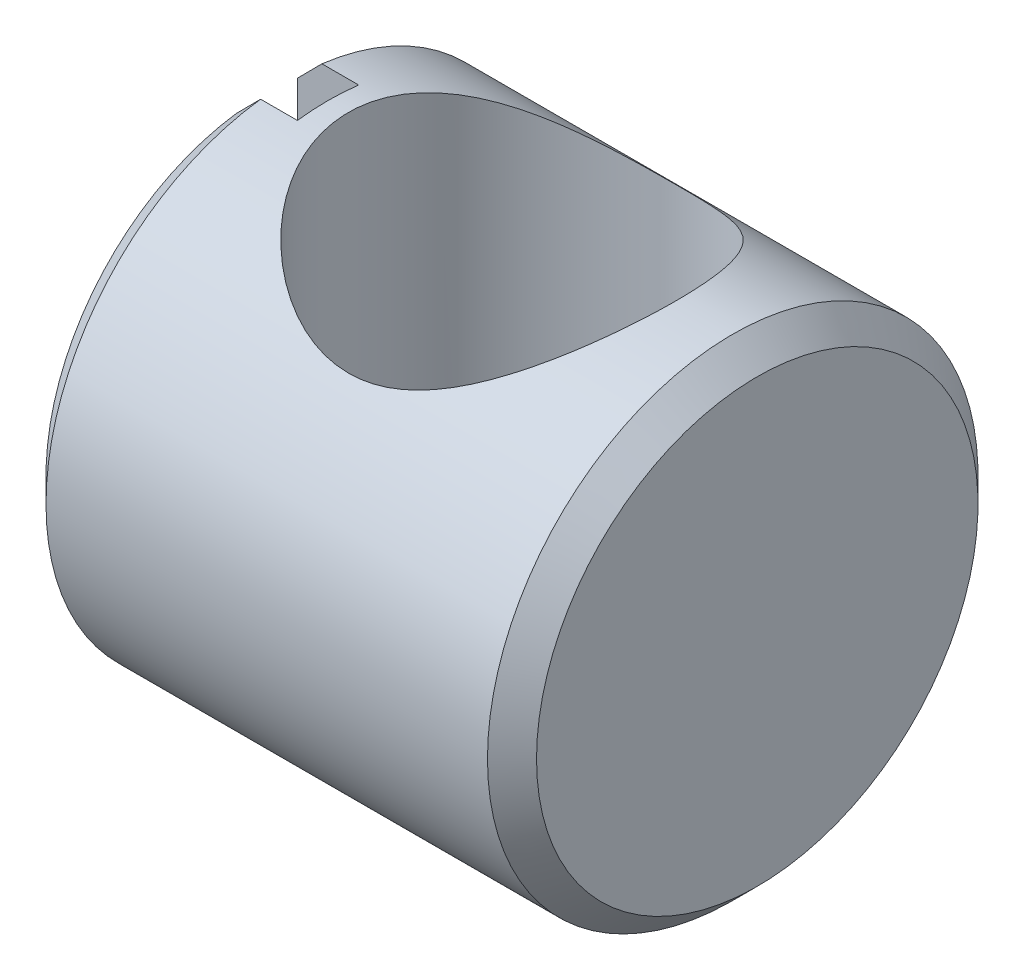
ISO-10303-21;
HEADER;
FILE_DESCRIPTION(('STEP AP214'),'2;1');
FILE_NAME('part.step','',(''),(''),'','','');
FILE_SCHEMA(('AUTOMOTIVE_DESIGN { 1 0 10303 214 1 1 1 1 }'));
ENDSEC;
DATA;
#1=APPLICATION_CONTEXT('core data for automotive mechanical design processes');
#2=APPLICATION_PROTOCOL_DEFINITION('international standard','automotive_design',2000,#1);
#3=PRODUCT_CONTEXT('',#1,'mechanical');
#4=PRODUCT('Part','Part','',(#3));
#5=PRODUCT_RELATED_PRODUCT_CATEGORY('part','',(#4));
#6=PRODUCT_DEFINITION_FORMATION('','',#4);
#7=PRODUCT_DEFINITION_CONTEXT('part definition',#1,'design');
#8=PRODUCT_DEFINITION('design','',#6,#7);
#9=PRODUCT_DEFINITION_SHAPE('','',#8);
#10=(LENGTH_UNIT() NAMED_UNIT(*) SI_UNIT(.MILLI.,.METRE.));
#11=(NAMED_UNIT(*) PLANE_ANGLE_UNIT() SI_UNIT($,.RADIAN.));
#12=(NAMED_UNIT(*) SI_UNIT($,.STERADIAN.) SOLID_ANGLE_UNIT());
#13=UNCERTAINTY_MEASURE_WITH_UNIT(LENGTH_MEASURE(1.E-05),#10,'distance_accuracy_value','');
#14=(GEOMETRIC_REPRESENTATION_CONTEXT(3) GLOBAL_UNCERTAINTY_ASSIGNED_CONTEXT((#13)) GLOBAL_UNIT_ASSIGNED_CONTEXT((#10,
#11,#12)) REPRESENTATION_CONTEXT('',''));
#15=CARTESIAN_POINT('',(0.,0.,0.));
#16=DIRECTION('',(0.,0.,1.));
#17=DIRECTION('',(1.,0.,0.));
#18=AXIS2_PLACEMENT_3D('',#15,#16,#17);
#19=CARTESIAN_POINT('',(-6.,0.,0.));
#20=DIRECTION('',(1.,0.,0.));
#21=DIRECTION('',(0.,0.,-1.));
#22=AXIS2_PLACEMENT_3D('',#19,#20,#21);
#23=PLANE('',#22);
#24=CARTESIAN_POINT('',(-6.,0.,0.));
#25=DIRECTION('',(1.,0.,0.));
#26=DIRECTION('',(0.,0.,-1.));
#27=AXIS2_PLACEMENT_3D('',#24,#25,#26);
#28=CIRCLE('',#27,5.4);
#29=CARTESIAN_POINT('',(-6.,5.34766304099277,-0.75));
#30=VERTEX_POINT('',#29);
#31=CARTESIAN_POINT('',(-6.,-5.34766304099277,-0.75));
#32=VERTEX_POINT('',#31);
#33=EDGE_CURVE('E104',#30,#32,#28,.F.);
#34=ORIENTED_EDGE('',*,*,#33,.T.);
#35=DIRECTION('',(0.,-1.,0.));
#36=VECTOR('',#35,1.);
#37=CARTESIAN_POINT('',(-6.,-6.91329450353351,-0.75));
#38=LINE('',#37,#36);
#39=EDGE_CURVE('E100',#30,#32,#38,.T.);
#40=ORIENTED_EDGE('',*,*,#39,.F.);
#41=EDGE_LOOP('',(#34,#40));
#42=FACE_BOUND('',#41,.T.);
#43=ADVANCED_FACE('F33',(#42),#23,.F.);
#44=CARTESIAN_POINT('',(-5.4,0.,0.));
#45=DIRECTION('',(1.,0.,0.));
#46=DIRECTION('',(0.,0.,-1.));
#47=AXIS2_PLACEMENT_3D('',#44,#45,#46);
#48=CONICAL_SURFACE('',#47,6.,0.78539816339745);
#49=CARTESIAN_POINT('',(1.80919438202028,13.1878852065825,-0.75));
#50=CARTESIAN_POINT('',(1.36128455783631,12.7392461922628,-0.75));
#51=CARTESIAN_POINT('',(0.913406468194163,12.2905754800868,-0.75));
#52=CARTESIAN_POINT('',(0.0177484563490185,11.3931259631863,-0.75));
#53=CARTESIAN_POINT('',(-0.430031464687112,10.9443471572972,-0.75));
#54=CARTESIAN_POINT('',(-1.32556166243395,10.0465332585077,-0.75));
#55=CARTESIAN_POINT('',(-1.77331190293746,9.59749812948737,-0.75));
#56=CARTESIAN_POINT('',(-2.66859019538763,8.69921629054598,-0.75));
#57=CARTESIAN_POINT('',(-3.11611824972982,8.24996958301248,-0.75));
#58=CARTESIAN_POINT('',(-4.0260327887569,7.33586499098885,-0.75));
#59=CARTESIAN_POINT('',(-4.48840745269406,6.87099533431439,-0.75));
#60=CARTESIAN_POINT('',(-5.18147783860191,6.17318653979524,-0.75));
#61=CARTESIAN_POINT('',(-5.41242334791986,5.94049553562875,-0.75));
#62=CARTESIAN_POINT('',(-5.87407440064189,5.47487717374236,-0.75));
#63=CARTESIAN_POINT('',(-6.10477994487561,5.24194981684516,-0.75));
#64=CARTESIAN_POINT('',(-6.56580472824704,4.77578719615383,-0.75));
#65=CARTESIAN_POINT('',(-6.79612402369197,4.54255198808365,-0.75));
#66=CARTESIAN_POINT('',(-7.25621887016506,4.075539729166,-0.75));
#67=CARTESIAN_POINT('',(-7.48599441393353,3.8417626711658,-0.75));
#68=CARTESIAN_POINT('',(-7.94463081147098,3.3733384757472,-0.75));
#69=CARTESIAN_POINT('',(-8.17349172006247,3.13869139215335,-0.75));
#70=CARTESIAN_POINT('',(-8.51547920792243,2.78546249136176,-0.75));
#71=CARTESIAN_POINT('',(-8.62925650787225,2.66751108737471,-0.75));
#72=CARTESIAN_POINT('',(-8.85616710479676,2.43099086680282,-0.75));
#73=CARTESIAN_POINT('',(-8.96930040685986,2.31242205511049,-0.75));
#74=CARTESIAN_POINT('',(-9.1425463266391,2.12932400514616,-0.75));
#75=CARTESIAN_POINT('',(-9.2030128599695,2.06512983632711,-0.75));
#76=CARTESIAN_POINT('',(-9.3235671229662,1.93638470761848,-0.75));
#77=CARTESIAN_POINT('',(-9.3836548468238,1.87183374228607,-0.75));
#78=CARTESIAN_POINT('',(-9.50312629772233,1.74248248605137,-0.75));
#79=CARTESIAN_POINT('',(-9.56251170888095,1.67768375495509,-0.75));
#80=CARTESIAN_POINT('',(-9.68058632696648,1.54745989826451,-0.75));
#81=CARTESIAN_POINT('',(-9.7392755582162,1.48203479469932,-0.75));
#82=CARTESIAN_POINT('',(-9.87542981264584,1.32798827943534,-0.75));
#83=CARTESIAN_POINT('',(-9.95251251463818,1.23902474595365,-0.75));
#84=CARTESIAN_POINT('',(-10.0660816678568,1.10337709305472,-0.75));
#85=CARTESIAN_POINT('',(-10.1037082432401,1.0576498907807,-0.75));
#86=CARTESIAN_POINT('',(-10.1778742950058,0.965324778242912,-0.75));
#87=CARTESIAN_POINT('',(-10.2144138782664,0.918726954321165,-0.75));
#88=CARTESIAN_POINT('',(-10.2863887620011,0.823773749617341,-0.75));
#89=CARTESIAN_POINT('',(-10.3218049915748,0.775403812853924,-0.75));
#90=CARTESIAN_POINT('',(-10.3903127601274,0.676922698699988,-0.75));
#91=CARTESIAN_POINT('',(-10.4234011542206,0.626809297422449,-0.75));
#92=CARTESIAN_POINT('',(-10.4855648828936,0.524715521760825,-0.75));
#93=CARTESIAN_POINT('',(-10.5146726232102,0.472755180400651,-0.75));
#94=CARTESIAN_POINT('',(-10.5668066673517,0.365882710864963,-0.75));
#95=CARTESIAN_POINT('',(-10.5898514633314,0.310980187877111,-0.75));
#96=CARTESIAN_POINT('',(-10.6162830295375,0.228704440059094,-0.75));
#97=CARTESIAN_POINT('',(-10.6235471202258,0.202584211584744,-0.75));
#98=CARTESIAN_POINT('',(-10.6356229808886,0.14977466464671,-0.75));
#99=CARTESIAN_POINT('',(-10.6404351476427,0.123085438989045,-0.75));
#100=CARTESIAN_POINT('',(-10.6472523224323,0.0695001853024896,-0.75));
#101=CARTESIAN_POINT('',(-10.6492733735813,0.042606240211174,-0.75));
#102=CARTESIAN_POINT('',(-10.6503988009997,-0.0112441017034372,-0.75));
#103=CARTESIAN_POINT('',(-10.6495031967964,-0.0382004981074072,-0.75));
#104=CARTESIAN_POINT('',(-10.6448776563398,-0.0917572676819829,-0.75));
#105=CARTESIAN_POINT('',(-10.6411587795608,-0.118358618923588,-0.75));
#106=CARTESIAN_POINT('',(-10.6311713907762,-0.171080683086219,-0.75));
#107=CARTESIAN_POINT('',(-10.6249017303465,-0.197201173968325,-0.75));
#108=CARTESIAN_POINT('',(-10.6101394856449,-0.249000619811594,-0.75));
#109=CARTESIAN_POINT('',(-10.601631132247,-0.274675007418899,-0.75));
#110=CARTESIAN_POINT('',(-10.5828135797956,-0.325340734120092,-0.75));
#111=CARTESIAN_POINT('',(-10.5725046329136,-0.350332168294904,-0.75));
#112=CARTESIAN_POINT('',(-10.5425443935579,-0.417335414310509,-0.75));
#113=CARTESIAN_POINT('',(-10.5214903244315,-0.458716963357769,-0.75));
#114=CARTESIAN_POINT('',(-10.4765022699106,-0.539897422343889,-0.75));
#115=CARTESIAN_POINT('',(-10.452565183075,-0.579694565508654,-0.75));
#116=CARTESIAN_POINT('',(-10.4026324610471,-0.658148804737047,-0.75));
#117=CARTESIAN_POINT('',(-10.3766303039673,-0.696801713110659,-0.75));
#118=CARTESIAN_POINT('',(-10.3232097358052,-0.773120685318126,-0.75));
#119=CARTESIAN_POINT('',(-10.2957909772586,-0.810786503590718,-0.75));
#120=CARTESIAN_POINT('',(-10.2115133070473,-0.923316522459236,-0.75));
#121=CARTESIAN_POINT('',(-10.1531000381505,-0.997013186462296,-0.75));
#122=CARTESIAN_POINT('',(-10.0638187785122,-1.10602745398594,-0.75));
#123=CARTESIAN_POINT('',(-10.0338159698326,-1.14207093556236,-0.75));
#124=CARTESIAN_POINT('',(-9.97334370071971,-1.21376375849977,-0.75));
#125=CARTESIAN_POINT('',(-9.94287425907193,-1.24941311562817,-0.75));
#126=CARTESIAN_POINT('',(-9.85220995896868,-1.35439512352365,-0.75));
#127=CARTESIAN_POINT('',(-9.79149956321538,-1.42328150589116,-0.75));
#128=CARTESIAN_POINT('',(-9.66914522457077,-1.56022201062609,-0.75));
#129=CARTESIAN_POINT('',(-9.60750123887388,-1.62827609457203,-0.75));
#130=CARTESIAN_POINT('',(-9.4215882464711,-1.83157347621719,-0.75));
#131=CARTESIAN_POINT('',(-9.29635464355085,-1.9659332274708,-0.75));
#132=CARTESIAN_POINT('',(-9.04435576395181,-2.23350287208285,-0.75));
#133=CARTESIAN_POINT('',(-8.91758883641468,-2.36671120027384,-0.75));
#134=CARTESIAN_POINT('',(-8.66320869666846,-2.63229614037899,-0.75));
#135=CARTESIAN_POINT('',(-8.53559555425894,-2.76467281917952,-0.75));
#136=CARTESIAN_POINT('',(-8.28110237841053,-3.02755506643238,-0.75));
#137=CARTESIAN_POINT('',(-8.15422792353667,-3.15806604449569,-0.75));
#138=CARTESIAN_POINT('',(-7.90009728856579,-3.41872103917976,-0.75));
#139=CARTESIAN_POINT('',(-7.7728411004653,-3.54886504799406,-0.75));
#140=CARTESIAN_POINT('',(-7.39079602511107,-3.93877400236833,-0.75));
#141=CARTESIAN_POINT('',(-7.13560521036708,-4.19814493509497,-0.75));
#142=CARTESIAN_POINT('',(-6.52317591321009,-4.81918092031523,-0.75));
#143=CARTESIAN_POINT('',(-6.16565499594644,-5.18056711579195,-0.75));
#144=CARTESIAN_POINT('',(-5.45000025431047,-5.90273417403172,-0.75));
#145=CARTESIAN_POINT('',(-5.09186642781912,-6.26351503469334,-0.75));
#146=CARTESIAN_POINT('',(-4.01678338504106,-7.34548488821209,-0.75));
#147=CARTESIAN_POINT('',(-3.29930463360352,-8.06614755042941,-0.75));
#148=CARTESIAN_POINT('',(-1.85009903950612,-9.52059583894537,-0.75));
#149=CARTESIAN_POINT('',(-1.11836089861224,-10.2543701978965,-0.75));
#150=CARTESIAN_POINT('',(-0.0205847639962783,-11.3546998801544,-0.75));
#151=CARTESIAN_POINT('',(0.345327910854907,-11.7213802165552,-0.75));
#152=CARTESIAN_POINT('',(1.07721759969504,-12.4546763479608,-0.75));
#153=CARTESIAN_POINT('',(1.44319461365518,-12.8212921429943,-0.75));
#154=CARTESIAN_POINT('',(1.80919438202028,-13.1878852065825,-0.75));
#155=B_SPLINE_CURVE_WITH_KNOTS('',3,(#49,#50,#51,#52,#53,#54,#55,#56,#57,#58,#59,#60,#61,#62,
#63,#64,#65,#66,#67,#68,#69,#70,#71,#72,#73,#74,#75,#76,#77,#78,#79,#80,#81,#82,#83,#84,#85,#86,
#87,#88,#89,#90,#91,#92,#93,#94,#95,#96,#97,#98,#99,#100,#101,#102,#103,#104,#105,#106,#107,
#108,#109,#110,#111,#112,#113,#114,#115,#116,#117,#118,#119,#120,#121,#122,#123,#124,#125,#126,
#127,#128,#129,#130,#131,#132,#133,#134,#135,#136,#137,#138,#139,#140,#141,#142,#143,#144,#145,
#146,#147,#148,#149,#150,#151,#152,#153,#154),.UNSPECIFIED.,.F.,.F.,(4,2,2,2,2,2,2,2,2,2,2,2,2,
2,2,2,2,2,2,2,2,2,2,2,2,2,2,2,2,2,2,2,2,2,2,2,2,2,2,2,2,2,2,2,2,2,2,2,2,2,2,2,4),(0.,
1.90186793257089,3.80375736307671,5.70612830726187,7.60847827493752,9.57546718857947,
10.5589956014095,11.5425206024451,12.5258869652138,13.5092663837822,14.4925859477328,
14.9842351529809,15.4758804681673,15.740442772299,16.005009123448,16.2686891221695,
16.5323598812603,16.8854487594989,17.0630907849188,17.2407152856157,17.4205210326753,
17.6005652076899,17.7790431775426,17.9569703024984,18.0382084810309,18.1194335091141,
18.2001896911167,18.2809453324489,18.361386255371,18.4418634348794,18.5229234125242,
18.6039720468873,18.7430724178114,18.8823237870985,19.0220339058594,19.1617784569764,
19.4437882632765,19.5844786028141,19.7251632933502,20.0006124047742,20.2760741841529,
20.8270723699567,21.3787287057193,21.9303400908148,22.4763906360338,23.0224527109578,
24.1140369863505,25.6390900300885,27.1641483571685,30.2149133582884,33.3237378141543,
34.8778031118819,36.4318677157614),.UNSPECIFIED.);
#156=CARTESIAN_POINT('',(-5.4,5.95294044989533,-0.75));
#157=VERTEX_POINT('',#156);
#158=EDGE_CURVE('E155',#157,#30,#155,.T.);
#159=ORIENTED_EDGE('',*,*,#158,.F.);
#160=CARTESIAN_POINT('',(-5.4,0.,0.));
#161=DIRECTION('',(1.,0.,0.));
#162=DIRECTION('',(0.,0.,-1.));
#163=AXIS2_PLACEMENT_3D('',#160,#161,#162);
#164=CIRCLE('',#163,6.);
#165=CARTESIAN_POINT('',(-5.4,-5.95294044989533,-0.75));
#166=VERTEX_POINT('',#165);
#167=EDGE_CURVE('E112',#166,#157,#164,.T.);
#168=ORIENTED_EDGE('',*,*,#167,.F.);
#169=EDGE_CURVE('E93',#32,#166,#155,.T.);
#170=ORIENTED_EDGE('',*,*,#169,.F.);
#171=ORIENTED_EDGE('',*,*,#33,.F.);
#172=EDGE_LOOP('',(#159,#168,#170,#171));
#173=FACE_BOUND('',#172,.T.);
#174=ADVANCED_FACE('F144',(#173),#48,.T.);
#175=CARTESIAN_POINT('',(6.,0.,0.));
#176=DIRECTION('',(-1.,0.,0.));
#177=DIRECTION('',(0.,0.,1.));
#178=AXIS2_PLACEMENT_3D('',#175,#176,#177);
#179=CYLINDRICAL_SURFACE('',#178,6.);
#180=ORIENTED_EDGE('',*,*,#167,.T.);
#181=DIRECTION('',(-1.,0.,0.));
#182=VECTOR('',#181,1.);
#183=CARTESIAN_POINT('',(6.,5.95294044989533,-0.75));
#184=LINE('',#183,#182);
#185=CARTESIAN_POINT('',(-4.5,5.95294044989533,-0.75));
#186=VERTEX_POINT('',#185);
#187=EDGE_CURVE('E56',#157,#186,#184,.F.);
#188=ORIENTED_EDGE('',*,*,#187,.T.);
#189=CARTESIAN_POINT('',(-4.5,0.,0.));
#190=DIRECTION('',(-1.,0.,0.));
#191=DIRECTION('',(0.,0.,1.));
#192=AXIS2_PLACEMENT_3D('',#189,#190,#191);
#193=CIRCLE('',#192,6.);
#194=CARTESIAN_POINT('',(-4.5,5.95294044989533,0.75));
#195=VERTEX_POINT('',#194);
#196=EDGE_CURVE('E11',#195,#186,#193,.T.);
#197=ORIENTED_EDGE('',*,*,#196,.F.);
#198=DIRECTION('',(-1.,0.,0.));
#199=VECTOR('',#198,1.);
#200=CARTESIAN_POINT('',(6.,5.95294044989533,0.75));
#201=LINE('',#200,#199);
#202=CARTESIAN_POINT('',(-5.4,5.95294044989533,0.75));
#203=VERTEX_POINT('',#202);
#204=EDGE_CURVE('E182',#195,#203,#201,.T.);
#205=ORIENTED_EDGE('',*,*,#204,.T.);
#206=CARTESIAN_POINT('',(-5.4,-5.95294044989533,0.75));
#207=VERTEX_POINT('',#206);
#208=EDGE_CURVE('E110',#203,#207,#164,.T.);
#209=ORIENTED_EDGE('',*,*,#208,.T.);
#210=DIRECTION('',(-1.,0.,0.));
#211=VECTOR('',#210,1.);
#212=CARTESIAN_POINT('',(6.,-5.95294044989533,0.75));
#213=LINE('',#212,#211);
#214=CARTESIAN_POINT('',(-4.5,-5.95294044989533,0.75));
#215=VERTEX_POINT('',#214);
#216=EDGE_CURVE('E88',#207,#215,#213,.F.);
#217=ORIENTED_EDGE('',*,*,#216,.T.);
#218=CARTESIAN_POINT('',(-4.5,-5.95294044989533,-0.75));
#219=VERTEX_POINT('',#218);
#220=EDGE_CURVE('E37',#219,#215,#193,.T.);
#221=ORIENTED_EDGE('',*,*,#220,.F.);
#222=DIRECTION('',(-1.,0.,0.));
#223=VECTOR('',#222,1.);
#224=CARTESIAN_POINT('',(6.,-5.95294044989533,-0.75));
#225=LINE('',#224,#223);
#226=EDGE_CURVE('E181',#219,#166,#225,.T.);
#227=ORIENTED_EDGE('',*,*,#226,.T.);
#228=EDGE_LOOP('',(#180,#188,#197,#205,#209,#217,#221,#227));
#229=FACE_BOUND('',#228,.T.);
#230=CARTESIAN_POINT('',(-4.,-6.,0.));
#231=CARTESIAN_POINT('',(-3.99999731509299,-5.9999978679194,0.200961877757264));
#232=CARTESIAN_POINT('',(-3.98477111179677,-5.9898153135426,0.401936080773152));
#233=CARTESIAN_POINT('',(-3.92480722053123,-5.95009379035347,0.79746821055015));
#234=CARTESIAN_POINT('',(-3.88005552185789,-5.92054563204443,0.992023045089949));
#235=CARTESIAN_POINT('',(-3.76378455728349,-5.84500964767637,1.36842380232543));
#236=CARTESIAN_POINT('',(-3.69239062773852,-5.79909884319835,1.55032457441004));
#237=CARTESIAN_POINT('',(-3.52587236557075,-5.69452202411023,1.89883175306967));
#238=CARTESIAN_POINT('',(-3.43074458752096,-5.63585415772491,2.06543593424075));
#239=CARTESIAN_POINT('',(-3.21069007401241,-5.50454977078536,2.3945652020353));
#240=CARTESIAN_POINT('',(-3.08391967515666,-5.43115036221204,2.55554447844211));
#241=CARTESIAN_POINT('',(-2.80852448379536,-5.27963383311262,2.85547224517315));
#242=CARTESIAN_POINT('',(-2.65986838038465,-5.20151004959,2.994388569064));
#243=CARTESIAN_POINT('',(-2.40961614455461,-5.07935723703535,3.19492879965059));
#244=CARTESIAN_POINT('',(-2.31452998061882,-5.03481061406829,3.26448421361659));
#245=CARTESIAN_POINT('',(-2.11801704850259,-4.9475474820456,3.39528506509656));
#246=CARTESIAN_POINT('',(-2.01658884818933,-4.90483139004999,3.45652861568795));
#247=CARTESIAN_POINT('',(-1.70342381658359,-4.78172496846676,3.62693348295433));
#248=CARTESIAN_POINT('',(-1.48230114462162,-4.70611539319262,3.72317686184202));
#249=CARTESIAN_POINT('',(-1.08655326709509,-4.59951859417335,3.85349251209103));
#250=CARTESIAN_POINT('',(-0.916936628689993,-4.56195075343585,3.89749210756546));
#251=CARTESIAN_POINT('',(-0.570517444896505,-4.5051611944835,3.96300919832951));
#252=CARTESIAN_POINT('',(-0.393727835129829,-4.48590785845124,3.98456544550022));
#253=CARTESIAN_POINT('',(-0.0370487026489552,-4.46873162662322,4.0038281338153));
#254=CARTESIAN_POINT('',(0.14285051256762,-4.47089592105774,4.00143708609998));
#255=CARTESIAN_POINT('',(0.499269480942147,-4.49639563989106,3.97275139872465));
#256=CARTESIAN_POINT('',(0.675786241624312,-4.51974900048769,3.94643650788514));
#257=CARTESIAN_POINT('',(1.01293421953744,-4.58254368658664,3.8732999414292));
#258=CARTESIAN_POINT('',(1.17392270387783,-4.62122975554715,3.82743424461756));
#259=CARTESIAN_POINT('',(1.48604735088561,-4.71019246530652,3.71740235584691));
#260=CARTESIAN_POINT('',(1.63718025143407,-4.76047291902481,3.65323014197261));
#261=CARTESIAN_POINT('',(1.95805080157593,-4.87928392523269,3.49347638019648));
#262=CARTESIAN_POINT('',(2.12531980389735,-4.94944635418484,3.39416104750469));
#263=CARTESIAN_POINT('',(2.4427667876367,-5.09383075529723,3.17337920726676));
#264=CARTESIAN_POINT('',(2.59292331466767,-5.16805765436997,3.05188537955522));
#265=CARTESIAN_POINT('',(2.90508509224792,-5.33086687505155,2.75962330697744));
#266=CARTESIAN_POINT('',(3.06266809764234,-5.41909489435193,2.58387876581438));
#267=CARTESIAN_POINT('',(3.34639298880042,-5.58436201336345,2.20401599801903));
#268=CARTESIAN_POINT('',(3.47256429075139,-5.6614115529751,1.99992459865342));
#269=CARTESIAN_POINT('',(3.66695543729926,-5.78290808179582,1.60971565422037));
#270=CARTESIAN_POINT('',(3.74168672669221,-5.83078522330772,1.42791528675114));
#271=CARTESIAN_POINT('',(3.86420985123641,-5.91015438061304,1.05207208786365));
#272=CARTESIAN_POINT('',(3.91202445426058,-5.94166024255169,0.858039758001343));
#273=CARTESIAN_POINT('',(3.97832233047986,-5.98551764313533,0.461970906346528));
#274=CARTESIAN_POINT('',(3.99667892187757,-5.99778644922351,0.259903623868826));
#275=CARTESIAN_POINT('',(4.00249417712337,-6.00166229930316,-0.144883038779203));
#276=CARTESIAN_POINT('',(3.98995500097723,-5.99327078771277,-0.347602372373323));
#277=CARTESIAN_POINT('',(3.93675188887639,-5.95799178848538,-0.73291143440841));
#278=CARTESIAN_POINT('',(3.89812540448978,-5.93244492780442,-0.915914889358566));
#279=CARTESIAN_POINT('',(3.79680862797405,-5.86636898569683,-1.27223278485462));
#280=CARTESIAN_POINT('',(3.73411449814297,-5.82583751494007,-1.44554567514148));
#281=CARTESIAN_POINT('',(3.58269540591081,-5.72992705058283,-1.78932950093283));
#282=CARTESIAN_POINT('',(3.49262369183871,-5.6737974027145,-1.95899236926607));
#283=CARTESIAN_POINT('',(3.29113342010503,-5.55203711223142,-2.28136604791135));
#284=CARTESIAN_POINT('',(3.17970167892662,-5.48640060808333,-2.43406629638971));
#285=CARTESIAN_POINT('',(2.91878426369545,-5.33909093306338,-2.7437089096605));
#286=CARTESIAN_POINT('',(2.76606747989177,-5.25652313598235,-2.89750375144749));
#287=CARTESIAN_POINT('',(2.43777714004379,-5.09142346174011,-3.17867936133274));
#288=CARTESIAN_POINT('',(2.26218792162753,-5.00889164843552,-3.30604187293363));
#289=CARTESIAN_POINT('',(1.90571517460788,-4.85879357933962,-3.52249553117939));
#290=CARTESIAN_POINT('',(1.72653593359257,-4.79055194025588,-3.61391272319835));
#291=CARTESIAN_POINT('',(1.35225469459667,-4.66877948558076,-3.76992427411385));
#292=CARTESIAN_POINT('',(1.157182121472,-4.61522225155449,-3.83456691107298));
#293=CARTESIAN_POINT('',(0.790871027182809,-4.53866416286692,-3.9247168714152));
#294=CARTESIAN_POINT('',(0.621656385629331,-4.51189995773817,-3.95517195853461));
#295=CARTESIAN_POINT('',(0.278853431987729,-4.47758933145201,-3.99398411126519));
#296=CARTESIAN_POINT('',(0.105270077800917,-4.47002203690265,-4.00236517901677));
#297=CARTESIAN_POINT('',(-0.241286093515516,-4.47528401304741,-3.99647846633069));
#298=CARTESIAN_POINT('',(-0.414258488378256,-4.48812536101584,-3.98219727499794));
#299=CARTESIAN_POINT('',(-0.754687131532797,-4.53220908525283,-3.93193984471959));
#300=CARTESIAN_POINT('',(-0.922135705736633,-4.56347600940483,-3.89593466197412));
#301=CARTESIAN_POINT('',(-1.29142202077443,-4.65053670224448,-3.7918611850225));
#302=CARTESIAN_POINT('',(-1.49053394888677,-4.71064593401662,-3.71780572154623));
#303=CARTESIAN_POINT('',(-1.87097514784975,-4.8444439609485,-3.54168854300469));
#304=CARTESIAN_POINT('',(-2.05227896329608,-4.91815177355726,-3.43958750756441));
#305=CARTESIAN_POINT('',(-2.39855810562116,-5.07234090111959,-3.20797320614047));
#306=CARTESIAN_POINT('',(-2.5631761432916,-5.15292108876611,-3.07799480000577));
#307=CARTESIAN_POINT('',(-2.87066631062144,-5.3125766931074,-2.79340674971918));
#308=CARTESIAN_POINT('',(-3.01353175145591,-5.39165164043383,-2.63878955904372));
#309=CARTESIAN_POINT('',(-3.21879506770052,-5.50971336238147,-2.37780795718262));
#310=CARTESIAN_POINT('',(-3.28948361559571,-5.55138661480074,-2.27907205499529));
#311=CARTESIAN_POINT('',(-3.42215785681578,-5.63101613508227,-2.07453205585638));
#312=CARTESIAN_POINT('',(-3.48414754958752,-5.66897410866294,-1.96873124035978));
#313=CARTESIAN_POINT('',(-3.59864385799369,-5.74005451433883,-1.75068617470797));
#314=CARTESIAN_POINT('',(-3.65115927748835,-5.77318143009499,-1.63844803554365));
#315=CARTESIAN_POINT('',(-3.74596123220397,-5.83360071790147,-1.40828926088829));
#316=CARTESIAN_POINT('',(-3.78825135953451,-5.86089513849429,-1.29037063843991));
#317=CARTESIAN_POINT('',(-3.88225688274283,-5.92199193347713,-0.98297372434935));
#318=CARTESIAN_POINT('',(-3.92620807661585,-5.95101863539404,-0.790052409981759));
#319=CARTESIAN_POINT('',(-3.98507005612642,-5.99001656656924,-0.398088285460989));
#320=CARTESIAN_POINT('',(-4.0000026593663,-6.00000211179877,-0.199050188671043));
#321=CARTESIAN_POINT('',(-4.,-6.,0.));
#322=B_SPLINE_CURVE_WITH_KNOTS('',3,(#230,#231,#232,#233,#234,#235,#236,#237,#238,#239,#240,
#241,#242,#243,#244,#245,#246,#247,#248,#249,#250,#251,#252,#253,#254,#255,#256,#257,#258,#259,
#260,#261,#262,#263,#264,#265,#266,#267,#268,#269,#270,#271,#272,#273,#274,#275,#276,#277,#278,
#279,#280,#281,#282,#283,#284,#285,#286,#287,#288,#289,#290,#291,#292,#293,#294,#295,#296,#297,
#298,#299,#300,#301,#302,#303,#304,#305,#306,#307,#308,#309,#310,#311,#312,#313,#314,#315,#316,
#317,#318,#319,#320,#321),.UNSPECIFIED.,.T.,.F.,(4,2,2,2,2,2,2,2,2,2,2,2,2,2,2,2,2,2,2,2,2,2,2,
2,2,2,2,2,2,2,2,2,2,2,2,2,2,2,2,2,2,2,2,2,2,4),(0.,0.602106453010799,1.20449882869738,
1.80409230638046,2.40377287734773,3.05434058001113,3.70584823208637,4.08328599770793,
4.46080930477325,5.21378174776238,5.74934951237418,6.28399099576978,6.82080987356116,
7.35808358412064,7.87165288288697,8.38539131508566,9.00362713220156,9.62262971458523,
10.3750547289191,11.1267724450113,11.7311573929193,12.3350303418404,12.9414933048691,
13.5479138696524,14.1117373348335,14.6756507417495,15.2737225755744,15.8721647378882,
16.5652391618099,17.2587907024992,17.8936743450736,18.5274081717985,19.0471565993068,
19.5663396456459,20.085830044675,20.6060141160321,21.2648078130679,21.9245299065431,
22.5962605430738,23.2681973183871,23.6528866112052,24.0373984529808,24.4215511301868,
24.8055686591805,25.4023963552989,25.9987751531553),.UNSPECIFIED.);
#323=CARTESIAN_POINT('',(-4.,-6.,0.));
#324=VERTEX_POINT('',#323);
#325=EDGE_CURVE('E121',#324,#324,#322,.T.);
#326=ORIENTED_EDGE('',*,*,#325,.T.);
#327=EDGE_LOOP('',(#326));
#328=FACE_BOUND('',#327,.T.);
#329=CARTESIAN_POINT('',(0.,4.47213595499958,4.));
#330=CARTESIAN_POINT('',(-0.0976431042767961,4.47213652903499,3.9999997170114));
#331=CARTESIAN_POINT('',(-0.195294310192039,4.47534825968156,3.99641730612005));
#332=CARTESIAN_POINT('',(-0.389671110507994,4.48803193728321,3.98216749684183));
#333=CARTESIAN_POINT('',(-0.486396554809572,4.4975048825291,3.97149896863994));
#334=CARTESIAN_POINT('',(-0.678202308290053,4.52226731495128,3.94327894993261));
#335=CARTESIAN_POINT('',(-0.773280373653546,4.53756416921657,3.92571874076452));
#336=CARTESIAN_POINT('',(-0.961017185261714,4.57329682264975,3.88403234303041));
#337=CARTESIAN_POINT('',(-1.05367466712393,4.59373525050868,3.85990279529085));
#338=CARTESIAN_POINT('',(-1.32534306403242,4.66111687256354,3.77874337281402));
#339=CARTESIAN_POINT('',(-1.50013982378419,4.71442667511778,3.7126228975306));
#340=CARTESIAN_POINT('',(-1.83576724177607,4.83168645535852,3.55867162885035));
#341=CARTESIAN_POINT('',(-1.99659499021817,4.89563864184272,3.47083632675902));
#342=CARTESIAN_POINT('',(-2.32727707568492,5.03891753094875,3.26005745637001));
#343=CARTESIAN_POINT('',(-2.49463975315962,5.11908788067006,3.13377721125875));
#344=CARTESIAN_POINT('',(-2.80802992505328,5.27890739397966,2.85635586366971));
#345=CARTESIAN_POINT('',(-2.95403638609229,5.35855597093179,2.70519055954671));
#346=CARTESIAN_POINT('',(-3.16466500480385,5.47824404715583,2.44937953697575));
#347=CARTESIAN_POINT('',(-3.23741444613628,5.52067267030404,2.35243673498693));
#348=CARTESIAN_POINT('',(-3.37437812042441,5.60208782112869,2.15136155819083));
#349=CARTESIAN_POINT('',(-3.43859599217526,5.64107581386889,2.04723227746582));
#350=CARTESIAN_POINT('',(-3.55775319295291,5.71449118697187,1.83234219550542));
#351=CARTESIAN_POINT('',(-3.6126977610832,5.74892114008633,1.72158518694981));
#352=CARTESIAN_POINT('',(-3.71255422631292,5.81219111953269,1.49410810151116));
#353=CARTESIAN_POINT('',(-3.75746827242419,5.84103234305902,1.37738930852113));
#354=CARTESIAN_POINT('',(-3.83204713507618,5.88930150734917,1.15232476869448));
#355=CARTESIAN_POINT('',(-3.86285681130377,5.90942214938083,1.04450655364945));
#356=CARTESIAN_POINT('',(-3.91544356489749,5.94392998168781,0.825799105876756));
#357=CARTESIAN_POINT('',(-3.93722241124833,5.95831829480637,0.714910479134195));
#358=CARTESIAN_POINT('',(-3.97133949262449,5.98091750199742,0.491177676230206));
#359=CARTESIAN_POINT('',(-3.98368700664222,5.98913446760102,0.378335534131116));
#360=CARTESIAN_POINT('',(-3.99873296308719,5.99915267333095,0.151731846797384));
#361=CARTESIAN_POINT('',(-4.00143276695451,6.0009548186868,0.0379704335570358));
#362=CARTESIAN_POINT('',(-3.99746401707152,5.99830969300002,-0.17194106385991));
#363=CARTESIAN_POINT('',(-3.99216085507976,5.99477321632292,-0.26813220215228));
#364=CARTESIAN_POINT('',(-3.97466734165138,5.98313776665227,-0.459637324613925));
#365=CARTESIAN_POINT('',(-3.96247497467015,5.97503745844046,-0.554951043783096));
#366=CARTESIAN_POINT('',(-3.93137237511753,5.95445649490763,-0.743961586831336));
#367=CARTESIAN_POINT('',(-3.91246442739173,5.94197732942491,-0.837658949289283));
#368=CARTESIAN_POINT('',(-3.86817911858324,5.91291254745206,-1.02287485090367));
#369=CARTESIAN_POINT('',(-3.84279924869989,5.89632533857619,-1.11439253004271));
#370=CARTESIAN_POINT('',(-3.75762944835944,5.84105189075018,-1.38404430733352));
#371=CARTESIAN_POINT('',(-3.68864867669769,5.79674494451934,-1.55823034228986));
#372=CARTESIAN_POINT('',(-3.52888626582203,5.69641870404176,-1.89244921235387));
#373=CARTESIAN_POINT('',(-3.43810064710602,5.64039727207995,-2.05247945665021));
#374=CARTESIAN_POINT('',(-3.22404814805066,5.5123651095054,-2.37655495419077));
#375=CARTESIAN_POINT('',(-3.09808066865483,5.43922063972583,-2.53836442964145));
#376=CARTESIAN_POINT('',(-2.82418690121862,5.28799955325509,-2.83999471116366));
#377=CARTESIAN_POINT('',(-2.67622674034056,5.20991543707304,-2.97978090076151));
#378=CARTESIAN_POINT('',(-2.42721574674742,5.08773984541218,-3.18157014723171));
#379=CARTESIAN_POINT('',(-2.33271227868357,5.04320645514736,-3.25150721692609));
#380=CARTESIAN_POINT('',(-2.13737033498879,4.95587543107793,-3.38312626486037));
#381=CARTESIAN_POINT('',(-2.03653044147773,4.9130781893162,-3.44480638573596));
#382=CARTESIAN_POINT('',(-1.72512860993122,4.78955438128977,-3.61662345708334));
#383=CARTESIAN_POINT('',(-1.5051935364611,4.71344096335056,-3.71393763368291));
#384=CARTESIAN_POINT('',(-1.11053791003781,4.60525059164611,-3.84666645765778));
#385=CARTESIAN_POINT('',(-0.940806842534166,4.56680546684651,-3.89181903898199));
#386=CARTESIAN_POINT('',(-0.593927426552538,4.50818261732419,-3.9595879131438));
#387=CARTESIAN_POINT('',(-0.416792497616826,4.48797322463755,-3.98224328128925));
#388=CARTESIAN_POINT('',(-0.0591122997030321,4.46895064863837,-4.00358886469355));
#389=CARTESIAN_POINT('',(0.12144441984716,4.47023054598763,-4.00217482316116));
#390=CARTESIAN_POINT('',(0.479367204728004,4.49419773882729,-3.97523236604319));
#391=CARTESIAN_POINT('',(0.656730564951217,4.51690238707747,-3.94968440341474));
#392=CARTESIAN_POINT('',(0.994778952363371,4.57855951758538,-3.87799627166596));
#393=CARTESIAN_POINT('',(1.15585545653512,4.61666373375477,-3.83292347110555));
#394=CARTESIAN_POINT('',(1.46825243450877,4.70459917396221,-3.72446085129646));
#395=CARTESIAN_POINT('',(1.61956961097379,4.75443433530856,-3.66106488053103));
#396=CARTESIAN_POINT('',(1.9404040496132,4.872229684616,-3.50326678270747));
#397=CARTESIAN_POINT('',(2.10751375344438,4.94182168928076,-3.40519994649144));
#398=CARTESIAN_POINT('',(2.424833474716,5.08525023546406,-3.18705526067334));
#399=CARTESIAN_POINT('',(2.57502255311189,5.15909186885109,-3.06695061214939));
#400=CARTESIAN_POINT('',(2.8879252802432,5.32151384678407,-2.77753026108397));
#401=CARTESIAN_POINT('',(3.04620809967553,5.4097901966463,-2.60319582989026));
#402=CARTESIAN_POINT('',(3.33163096483464,5.57551048398205,-2.22621086715598));
#403=CARTESIAN_POINT('',(3.45879852686143,5.65296396629924,-2.02358560510326));
#404=CARTESIAN_POINT('',(3.65579076204139,5.77581992286068,-1.63493887447291));
#405=CARTESIAN_POINT('',(3.73193778049153,5.82452105814132,-1.45320204698569));
#406=CARTESIAN_POINT('',(3.82592544130727,5.88533352211419,-1.17138183549999));
#407=CARTESIAN_POINT('',(3.85388507421953,5.90356620627073,-1.07589158653012));
#408=CARTESIAN_POINT('',(3.90273054542087,5.93556745605549,-0.88240209451729));
#409=CARTESIAN_POINT('',(3.92361924495917,5.9493378272596,-0.784403883627619));
#410=CARTESIAN_POINT('',(3.95811641427634,5.97214517635192,-0.586086273383312));
#411=CARTESIAN_POINT('',(3.97168850355103,5.98115849610353,-0.485757815796167));
#412=CARTESIAN_POINT('',(3.99118530693697,5.99412268314715,-0.284073777175738));
#413=CARTESIAN_POINT('',(3.99711319664219,5.99807565263174,-0.182718640298805));
#414=CARTESIAN_POINT('',(4.00123655561931,6.00082424526325,0.0202340535985093));
#415=CARTESIAN_POINT('',(3.99943087210654,5.99961909952936,0.121831644503642));
#416=CARTESIAN_POINT('',(3.98811428819264,5.99208126729968,0.324399587194813));
#417=CARTESIAN_POINT('',(3.97860373845679,5.98574881415886,0.425369967315848));
#418=CARTESIAN_POINT('',(3.95299767244827,5.96876081261163,0.61854276228154));
#419=CARTESIAN_POINT('',(3.93743382207233,5.9584547811461,0.710846956330396));
#420=CARTESIAN_POINT('',(3.9000175204581,5.93379662677188,0.893633165742329));
#421=CARTESIAN_POINT('',(3.87816293645131,5.9194431316717,0.984114551962114));
#422=CARTESIAN_POINT('',(3.80354102818032,5.87073041361369,1.25193819195833));
#423=CARTESIAN_POINT('',(3.74169386694218,5.83070421406515,1.42581956476813));
#424=CARTESIAN_POINT('',(3.59211762077758,5.73583289872471,1.77032329578652));
#425=CARTESIAN_POINT('',(3.50309800899164,5.68026433244725,1.94017490918903));
#426=CARTESIAN_POINT('',(3.30370008759165,5.55950881157675,2.26309758994044));
#427=CARTESIAN_POINT('',(3.19330899770416,5.49431610725801,2.41615853013136));
#428=CARTESIAN_POINT('',(2.93474157779382,5.3478584276731,2.72659100620765));
#429=CARTESIAN_POINT('',(2.78335313226705,5.26567827332442,2.88085428517868));
#430=CARTESIAN_POINT('',(2.45777373790424,5.10106715721585,3.16319975045765));
#431=CARTESIAN_POINT('',(2.28356588908469,5.0186360542384,3.29126235074365));
#432=CARTESIAN_POINT('',(1.92826235530597,4.86768444283591,3.51026526963469));
#433=CARTESIAN_POINT('',(1.74870760386184,4.79858239645188,3.60329311149619));
#434=CARTESIAN_POINT('',(1.37343986108561,4.67494937150071,3.76231587359292));
#435=CARTESIAN_POINT('',(1.17775916074213,4.62039015757174,3.82836331194184));
#436=CARTESIAN_POINT('',(0.818431729359446,4.54382295979552,3.91872563367308));
#437=CARTESIAN_POINT('',(0.657298728570429,4.51728034128466,3.94904582920259));
#438=CARTESIAN_POINT('',(0.412440048142604,4.49037557280687,3.9795333908914));
#439=CARTESIAN_POINT('',(0.330287580160235,4.48355881575825,3.98719713542874));
#440=CARTESIAN_POINT('',(0.165425245158553,4.47443935364751,3.99742989402555));
#441=CARTESIAN_POINT('',(0.0827155295041939,4.4721354687221,4.0000002397256));
#442=CARTESIAN_POINT('',(0.,4.47213595499958,4.));
#443=B_SPLINE_CURVE_WITH_KNOTS('',3,(#329,#330,#331,#332,#333,#334,#335,#336,#337,#338,#339,
#340,#341,#342,#343,#344,#345,#346,#347,#348,#349,#350,#351,#352,#353,#354,#355,#356,#357,#358,
#359,#360,#361,#362,#363,#364,#365,#366,#367,#368,#369,#370,#371,#372,#373,#374,#375,#376,#377,
#378,#379,#380,#381,#382,#383,#384,#385,#386,#387,#388,#389,#390,#391,#392,#393,#394,#395,#396,
#397,#398,#399,#400,#401,#402,#403,#404,#405,#406,#407,#408,#409,#410,#411,#412,#413,#414,#415,
#416,#417,#418,#419,#420,#421,#422,#423,#424,#425,#426,#427,#428,#429,#430,#431,#432,#433,#434,
#435,#436,#437,#438,#439,#440,#441,#442),.UNSPECIFIED.,.T.,.F.,(4,2,2,2,2,2,2,2,2,2,2,2,2,2,2,2,
2,2,2,2,2,2,2,2,2,2,2,2,2,2,2,2,2,2,2,2,2,2,2,2,2,2,2,2,2,2,2,2,2,2,2,2,2,2,2,2,4),(0.,
0.292826766938381,0.585700233571984,0.878945414888602,1.17234082709946,1.75280804501343,
2.33339588791186,3.00435628395761,3.6759731112973,4.06076920977815,4.44540065855946,
4.82981407081667,5.21414504437427,5.55540517330862,5.89659842362191,6.23745555789769,
6.57826459009638,6.86712000583197,7.15605997452396,7.44490173103991,7.7338556259405,
8.30887949972939,8.88400839832558,9.53471337919827,10.1864311561983,10.5631761651892,
10.9400057794147,11.6916411041948,12.2289535173423,12.7653310340256,13.3040324620766,
13.8431705807278,14.3559607435295,14.8689232623495,15.4844163104974,16.1006628454805,
16.8515253998696,17.6017215209019,18.2078433216843,18.5109911513255,18.814016165318,
19.1185343346241,19.4229259585792,19.727362957447,20.0317861015004,20.313975604428,
20.5962608919214,21.1603518047836,21.7570825066449,22.3541711655486,23.0451693726172,
23.736682255299,24.3754077628613,25.0128839799114,25.509057573012,25.757182172089,
26.0052418918174),.UNSPECIFIED.);
#444=CARTESIAN_POINT('',(0.,4.47213595499958,4.));
#445=VERTEX_POINT('',#444);
#446=EDGE_CURVE('E107',#445,#445,#443,.T.);
#447=ORIENTED_EDGE('',*,*,#446,.T.);
#448=EDGE_LOOP('',(#447));
#449=FACE_BOUND('',#448,.T.);
#450=CARTESIAN_POINT('',(5.4,0.,0.));
#451=DIRECTION('',(1.,0.,0.));
#452=DIRECTION('',(0.,0.,-1.));
#453=AXIS2_PLACEMENT_3D('',#450,#451,#452);
#454=CIRCLE('',#453,6.);
#455=CARTESIAN_POINT('',(5.4,0.,6.));
#456=VERTEX_POINT('',#455);
#457=EDGE_CURVE('E185',#456,#456,#454,.F.);
#458=ORIENTED_EDGE('',*,*,#457,.T.);
#459=EDGE_LOOP('',(#458));
#460=FACE_BOUND('',#459,.T.);
#461=ADVANCED_FACE('F124',(#229,#328,#449,#460),#179,.T.);
#462=CARTESIAN_POINT('',(6.,0.,0.));
#463=DIRECTION('',(1.,0.,0.));
#464=DIRECTION('',(0.,0.,-1.));
#465=AXIS2_PLACEMENT_3D('',#462,#463,#464);
#466=PLANE('',#465);
#467=CARTESIAN_POINT('',(6.,0.,0.));
#468=DIRECTION('',(1.,0.,0.));
#469=DIRECTION('',(0.,0.,-1.));
#470=AXIS2_PLACEMENT_3D('',#467,#468,#469);
#471=CIRCLE('',#470,5.4);
#472=CARTESIAN_POINT('',(6.,0.,5.4));
#473=VERTEX_POINT('',#472);
#474=EDGE_CURVE('E103',#473,#473,#471,.T.);
#475=ORIENTED_EDGE('',*,*,#474,.T.);
#476=EDGE_LOOP('',(#475));
#477=FACE_BOUND('',#476,.T.);
#478=ADVANCED_FACE('F136',(#477),#466,.T.);
#479=CARTESIAN_POINT('',(-6.,-5.34766304099277,0.75));
#480=VERTEX_POINT('',#479);
#481=CARTESIAN_POINT('',(-6.,5.34766304099277,0.75));
#482=VERTEX_POINT('',#481);
#483=EDGE_CURVE('E99',#480,#482,#28,.F.);
#484=ORIENTED_EDGE('',*,*,#483,.T.);
#485=DIRECTION('',(0.,1.,0.));
#486=VECTOR('',#485,1.);
#487=CARTESIAN_POINT('',(-6.,-6.91329450353351,0.75));
#488=LINE('',#487,#486);
#489=EDGE_CURVE('E48',#480,#482,#488,.T.);
#490=ORIENTED_EDGE('',*,*,#489,.F.);
#491=EDGE_LOOP('',(#484,#490));
#492=FACE_BOUND('',#491,.T.);
#493=ADVANCED_FACE('F98',(#492),#23,.F.);
#494=CARTESIAN_POINT('',(1.80919438202028,-13.1878852065825,0.75));
#495=CARTESIAN_POINT('',(1.36128455783631,-12.7392461922628,0.75));
#496=CARTESIAN_POINT('',(0.913406468194163,-12.2905754800868,0.75));
#497=CARTESIAN_POINT('',(0.0177484563490175,-11.3931259631863,0.75));
#498=CARTESIAN_POINT('',(-0.430031464687113,-10.9443471572972,0.75));
#499=CARTESIAN_POINT('',(-1.32556166243395,-10.0465332585077,0.75));
#500=CARTESIAN_POINT('',(-1.77331190293746,-9.59749812948737,0.75));
#501=CARTESIAN_POINT('',(-2.66859019538763,-8.69921629054598,0.75));
#502=CARTESIAN_POINT('',(-3.11611824972982,-8.24996958301248,0.75));
#503=CARTESIAN_POINT('',(-4.02603278875691,-7.33586499098885,0.75));
#504=CARTESIAN_POINT('',(-4.48840745269406,-6.87099533431439,0.75));
#505=CARTESIAN_POINT('',(-5.18147783860191,-6.17318653979523,0.75));
#506=CARTESIAN_POINT('',(-5.41242334791986,-5.94049553562875,0.75));
#507=CARTESIAN_POINT('',(-5.87407440064189,-5.47487717374236,0.75));
#508=CARTESIAN_POINT('',(-6.10477994487561,-5.24194981684516,0.75));
#509=CARTESIAN_POINT('',(-6.56580472824704,-4.77578719615384,0.75));
#510=CARTESIAN_POINT('',(-6.79612402369197,-4.54255198808365,0.75));
#511=CARTESIAN_POINT('',(-7.25621887016506,-4.075539729166,0.75));
#512=CARTESIAN_POINT('',(-7.48599441393352,-3.8417626711658,0.75));
#513=CARTESIAN_POINT('',(-7.94463081147098,-3.3733384757472,0.75));
#514=CARTESIAN_POINT('',(-8.17349172006247,-3.13869139215335,0.75));
#515=CARTESIAN_POINT('',(-8.51547920792243,-2.78546249136176,0.75));
#516=CARTESIAN_POINT('',(-8.62925650787225,-2.66751108737472,0.75));
#517=CARTESIAN_POINT('',(-8.85616710479676,-2.43099086680282,0.75));
#518=CARTESIAN_POINT('',(-8.96930040685985,-2.31242205511049,0.75));
#519=CARTESIAN_POINT('',(-9.1425463266391,-2.12932400514616,0.75));
#520=CARTESIAN_POINT('',(-9.2030128599695,-2.06512983632712,0.75));
#521=CARTESIAN_POINT('',(-9.3235671229662,-1.93638470761848,0.75));
#522=CARTESIAN_POINT('',(-9.3836548468238,-1.87183374228607,0.75));
#523=CARTESIAN_POINT('',(-9.50312629772233,-1.74248248605138,0.75));
#524=CARTESIAN_POINT('',(-9.56251170888095,-1.67768375495509,0.75));
#525=CARTESIAN_POINT('',(-9.68058632696647,-1.54745989826451,0.75));
#526=CARTESIAN_POINT('',(-9.73927555821619,-1.48203479469932,0.75));
#527=CARTESIAN_POINT('',(-9.87542981264584,-1.32798827943534,0.75));
#528=CARTESIAN_POINT('',(-9.95251251463818,-1.23902474595365,0.75));
#529=CARTESIAN_POINT('',(-10.0660816678568,-1.10337709305472,0.75));
#530=CARTESIAN_POINT('',(-10.1037082432401,-1.0576498907807,0.75));
#531=CARTESIAN_POINT('',(-10.1778742950058,-0.965324778242912,0.75));
#532=CARTESIAN_POINT('',(-10.2144138782664,-0.918726954321166,0.75));
#533=CARTESIAN_POINT('',(-10.2863887620011,-0.823773749617341,0.75));
#534=CARTESIAN_POINT('',(-10.3218049915748,-0.775403812853924,0.75));
#535=CARTESIAN_POINT('',(-10.3903127601274,-0.676922698699986,0.75));
#536=CARTESIAN_POINT('',(-10.4234011542206,-0.626809297422448,0.75));
#537=CARTESIAN_POINT('',(-10.4855648828936,-0.524715521760825,0.75));
#538=CARTESIAN_POINT('',(-10.5146726232102,-0.472755180400652,0.75));
#539=CARTESIAN_POINT('',(-10.5668066673517,-0.365882710864963,0.75));
#540=CARTESIAN_POINT('',(-10.5898514633314,-0.31098018787711,0.75));
#541=CARTESIAN_POINT('',(-10.6162830295375,-0.228704440059094,0.75));
#542=CARTESIAN_POINT('',(-10.6235471202258,-0.202584211584744,0.75));
#543=CARTESIAN_POINT('',(-10.6356229808886,-0.149774664646711,0.75));
#544=CARTESIAN_POINT('',(-10.6404351476427,-0.123085438989048,0.75));
#545=CARTESIAN_POINT('',(-10.6472523224323,-0.0695001853024923,0.75));
#546=CARTESIAN_POINT('',(-10.6492733735813,-0.0426062402111756,0.75));
#547=CARTESIAN_POINT('',(-10.6503988009997,0.011244101703437,0.75));
#548=CARTESIAN_POINT('',(-10.6495031967964,0.0382004981074069,0.75));
#549=CARTESIAN_POINT('',(-10.6448776563398,0.0917572676819827,0.75));
#550=CARTESIAN_POINT('',(-10.6411587795608,0.118358618923588,0.75));
#551=CARTESIAN_POINT('',(-10.6311713907762,0.171080683086219,0.75));
#552=CARTESIAN_POINT('',(-10.6249017303465,0.197201173968325,0.75));
#553=CARTESIAN_POINT('',(-10.6101394856449,0.249000619811594,0.75));
#554=CARTESIAN_POINT('',(-10.601631132247,0.274675007418898,0.75));
#555=CARTESIAN_POINT('',(-10.5828135797956,0.325340734120092,0.75));
#556=CARTESIAN_POINT('',(-10.5725046329136,0.350332168294904,0.75));
#557=CARTESIAN_POINT('',(-10.5425443935579,0.417335414310508,0.75));
#558=CARTESIAN_POINT('',(-10.5214903244315,0.458716963357768,0.75));
#559=CARTESIAN_POINT('',(-10.4765022699106,0.539897422343888,0.75));
#560=CARTESIAN_POINT('',(-10.452565183075,0.579694565508654,0.75));
#561=CARTESIAN_POINT('',(-10.4026324610471,0.658148804737047,0.75));
#562=CARTESIAN_POINT('',(-10.3766303039673,0.696801713110659,0.75));
#563=CARTESIAN_POINT('',(-10.3232097358052,0.773120685318127,0.75));
#564=CARTESIAN_POINT('',(-10.2957909772586,0.81078650359072,0.75));
#565=CARTESIAN_POINT('',(-10.2115133070472,0.923316522459237,0.75));
#566=CARTESIAN_POINT('',(-10.1531000381505,0.997013186462296,0.75));
#567=CARTESIAN_POINT('',(-10.0638187785123,1.10602745398594,0.75));
#568=CARTESIAN_POINT('',(-10.0338159698326,1.14207093556236,0.75));
#569=CARTESIAN_POINT('',(-9.97334370071971,1.21376375849976,0.75));
#570=CARTESIAN_POINT('',(-9.94287425907193,1.24941311562817,0.75));
#571=CARTESIAN_POINT('',(-9.85220995896869,1.35439512352365,0.75));
#572=CARTESIAN_POINT('',(-9.79149956321538,1.42328150589116,0.75));
#573=CARTESIAN_POINT('',(-9.66914522457078,1.56022201062609,0.75));
#574=CARTESIAN_POINT('',(-9.60750123887388,1.62827609457202,0.75));
#575=CARTESIAN_POINT('',(-9.42158824647111,1.83157347621719,0.75));
#576=CARTESIAN_POINT('',(-9.29635464355085,1.9659332274708,0.75));
#577=CARTESIAN_POINT('',(-9.04435576395181,2.23350287208284,0.75));
#578=CARTESIAN_POINT('',(-8.91758883641469,2.36671120027383,0.75));
#579=CARTESIAN_POINT('',(-8.66320869666847,2.63229614037898,0.75));
#580=CARTESIAN_POINT('',(-8.53559555425895,2.76467281917952,0.75));
#581=CARTESIAN_POINT('',(-8.28110237841053,3.02755506643238,0.75));
#582=CARTESIAN_POINT('',(-8.15422792353668,3.15806604449568,0.75));
#583=CARTESIAN_POINT('',(-7.90009728856579,3.41872103917976,0.75));
#584=CARTESIAN_POINT('',(-7.77284110046531,3.54886504799406,0.75));
#585=CARTESIAN_POINT('',(-7.39079602511108,3.93877400236833,0.75));
#586=CARTESIAN_POINT('',(-7.13560521036709,4.19814493509496,0.75));
#587=CARTESIAN_POINT('',(-6.5231759132101,4.81918092031522,0.75));
#588=CARTESIAN_POINT('',(-6.16565499594644,5.18056711579194,0.75));
#589=CARTESIAN_POINT('',(-5.45000025431048,5.90273417403172,0.75));
#590=CARTESIAN_POINT('',(-5.09186642781913,6.26351503469334,0.75));
#591=CARTESIAN_POINT('',(-4.01678338504106,7.34548488821208,0.75));
#592=CARTESIAN_POINT('',(-3.29930463360352,8.06614755042941,0.75));
#593=CARTESIAN_POINT('',(-1.85009903950612,9.52059583894537,0.75));
#594=CARTESIAN_POINT('',(-1.11836089861224,10.2543701978965,0.75));
#595=CARTESIAN_POINT('',(-0.0205847639962792,11.3546998801543,0.75));
#596=CARTESIAN_POINT('',(0.345327910854908,11.7213802165552,0.75));
#597=CARTESIAN_POINT('',(1.07721759969504,12.4546763479608,0.75));
#598=CARTESIAN_POINT('',(1.44319461365518,12.8212921429943,0.75));
#599=CARTESIAN_POINT('',(1.80919438202028,13.1878852065825,0.75));
#600=B_SPLINE_CURVE_WITH_KNOTS('',3,(#494,#495,#496,#497,#498,#499,#500,#501,#502,#503,#504,
#505,#506,#507,#508,#509,#510,#511,#512,#513,#514,#515,#516,#517,#518,#519,#520,#521,#522,#523,
#524,#525,#526,#527,#528,#529,#530,#531,#532,#533,#534,#535,#536,#537,#538,#539,#540,#541,#542,
#543,#544,#545,#546,#547,#548,#549,#550,#551,#552,#553,#554,#555,#556,#557,#558,#559,#560,#561,
#562,#563,#564,#565,#566,#567,#568,#569,#570,#571,#572,#573,#574,#575,#576,#577,#578,#579,#580,
#581,#582,#583,#584,#585,#586,#587,#588,#589,#590,#591,#592,#593,#594,#595,#596,#597,#598,#599),
.UNSPECIFIED.,.F.,.F.,(4,2,2,2,2,2,2,2,2,2,2,2,2,2,2,2,2,2,2,2,2,2,2,2,2,2,2,2,2,2,2,2,2,2,2,2,
2,2,2,2,2,2,2,2,2,2,2,2,2,2,2,2,4),(0.,1.90186793257089,3.80375736307671,5.70612830726187,
7.60847827493752,9.57546718857947,10.5589956014095,11.5425206024451,12.5258869652138,
13.5092663837822,14.4925859477328,14.9842351529809,15.4758804681673,15.740442772299,
16.005009123448,16.2686891221695,16.5323598812602,16.8854487594989,17.0630907849188,
17.2407152856157,17.4205210326753,17.6005652076899,17.7790431775426,17.9569703024984,
18.0382084810309,18.1194335091141,18.2001896911167,18.2809453324489,18.361386255371,
18.4418634348794,18.5229234125242,18.6039720468873,18.7430724178114,18.8823237870985,
19.0220339058594,19.1617784569764,19.4437882632765,19.5844786028141,19.7251632933502,
20.0006124047742,20.2760741841529,20.8270723699567,21.3787287057193,21.9303400908148,
22.4763906360338,23.0224527109578,24.1140369863505,25.6390900300885,27.1641483571685,
30.2149133582884,33.3237378141543,34.8778031118819,36.4318677157614),.UNSPECIFIED.);
#601=EDGE_CURVE('E84',#207,#480,#600,.T.);
#602=ORIENTED_EDGE('',*,*,#601,.F.);
#603=ORIENTED_EDGE('',*,*,#208,.F.);
#604=EDGE_CURVE('E94',#482,#203,#600,.T.);
#605=ORIENTED_EDGE('',*,*,#604,.F.);
#606=ORIENTED_EDGE('',*,*,#483,.F.);
#607=EDGE_LOOP('',(#602,#603,#605,#606));
#608=FACE_BOUND('',#607,.T.);
#609=ADVANCED_FACE('F102',(#608),#48,.T.);
#610=CARTESIAN_POINT('',(6.,0.,0.));
#611=DIRECTION('',(-1.,0.,0.));
#612=DIRECTION('',(0.,0.,1.));
#613=AXIS2_PLACEMENT_3D('',#610,#611,#612);
#614=CONICAL_SURFACE('',#613,5.4,0.785398163397448);
#615=CARTESIAN_POINT('',(5.4,0.,6.));
#616=CARTESIAN_POINT('',(5.40625,0.,5.99375));
#617=CARTESIAN_POINT('',(5.4125,0.,5.9875));
#618=CARTESIAN_POINT('',(5.425,0.,5.975));
#619=CARTESIAN_POINT('',(5.43125,0.,5.96875));
#620=CARTESIAN_POINT('',(5.44375,0.,5.95625));
#621=CARTESIAN_POINT('',(5.45,0.,5.95));
#622=CARTESIAN_POINT('',(5.4625,0.,5.9375));
#623=CARTESIAN_POINT('',(5.46875,0.,5.93125));
#624=CARTESIAN_POINT('',(5.48125,0.,5.91875));
#625=CARTESIAN_POINT('',(5.4875,0.,5.9125));
#626=CARTESIAN_POINT('',(5.5,0.,5.9));
#627=CARTESIAN_POINT('',(5.50625,0.,5.89375));
#628=CARTESIAN_POINT('',(5.51875,0.,5.88125));
#629=CARTESIAN_POINT('',(5.525,0.,5.875));
#630=CARTESIAN_POINT('',(5.5375,0.,5.8625));
#631=CARTESIAN_POINT('',(5.54375,0.,5.85625));
#632=CARTESIAN_POINT('',(5.55625,0.,5.84375));
#633=CARTESIAN_POINT('',(5.5625,0.,5.8375));
#634=CARTESIAN_POINT('',(5.575,0.,5.825));
#635=CARTESIAN_POINT('',(5.58125,0.,5.81875));
#636=CARTESIAN_POINT('',(5.59375,0.,5.80625));
#637=CARTESIAN_POINT('',(5.6,0.,5.8));
#638=CARTESIAN_POINT('',(5.6125,0.,5.7875));
#639=CARTESIAN_POINT('',(5.61875,0.,5.78125));
#640=CARTESIAN_POINT('',(5.63125,0.,5.76875));
#641=CARTESIAN_POINT('',(5.6375,0.,5.7625));
#642=CARTESIAN_POINT('',(5.65,0.,5.75));
#643=CARTESIAN_POINT('',(5.65625,0.,5.74375));
#644=CARTESIAN_POINT('',(5.66875,0.,5.73125));
#645=CARTESIAN_POINT('',(5.675,0.,5.725));
#646=CARTESIAN_POINT('',(5.6875,0.,5.7125));
#647=CARTESIAN_POINT('',(5.69375,0.,5.70625));
#648=CARTESIAN_POINT('',(5.70625,0.,5.69375));
#649=CARTESIAN_POINT('',(5.7125,0.,5.6875));
#650=CARTESIAN_POINT('',(5.725,0.,5.675));
#651=CARTESIAN_POINT('',(5.73125,0.,5.66875));
#652=CARTESIAN_POINT('',(5.74375,0.,5.65625));
#653=CARTESIAN_POINT('',(5.75,0.,5.65));
#654=CARTESIAN_POINT('',(5.7625,0.,5.6375));
#655=CARTESIAN_POINT('',(5.76875,0.,5.63125));
#656=CARTESIAN_POINT('',(5.78125,0.,5.61875));
#657=CARTESIAN_POINT('',(5.7875,0.,5.6125));
#658=CARTESIAN_POINT('',(5.8,0.,5.6));
#659=CARTESIAN_POINT('',(5.80625,0.,5.59375));
#660=CARTESIAN_POINT('',(5.81875,0.,5.58125));
#661=CARTESIAN_POINT('',(5.825,0.,5.575));
#662=CARTESIAN_POINT('',(5.8375,0.,5.5625));
#663=CARTESIAN_POINT('',(5.84375,0.,5.55625));
#664=CARTESIAN_POINT('',(5.85625,0.,5.54375));
#665=CARTESIAN_POINT('',(5.8625,0.,5.5375));
#666=CARTESIAN_POINT('',(5.875,0.,5.525));
#667=CARTESIAN_POINT('',(5.88125,0.,5.51875));
#668=CARTESIAN_POINT('',(5.89375,0.,5.50625));
#669=CARTESIAN_POINT('',(5.9,0.,5.5));
#670=CARTESIAN_POINT('',(5.9125,0.,5.4875));
#671=CARTESIAN_POINT('',(5.91875,0.,5.48125));
#672=CARTESIAN_POINT('',(5.93125,0.,5.46875));
#673=CARTESIAN_POINT('',(5.9375,0.,5.4625));
#674=CARTESIAN_POINT('',(5.95,0.,5.45));
#675=CARTESIAN_POINT('',(5.95625,0.,5.44375));
#676=CARTESIAN_POINT('',(5.96875,0.,5.43125));
#677=CARTESIAN_POINT('',(5.975,0.,5.425));
#678=CARTESIAN_POINT('',(5.9875,0.,5.4125));
#679=CARTESIAN_POINT('',(5.99375,0.,5.40625));
#680=CARTESIAN_POINT('',(6.,0.,5.4));
#681=B_SPLINE_CURVE_WITH_KNOTS('',3,(#615,#616,#617,#618,#619,#620,#621,#622,#623,#624,#625,
#626,#627,#628,#629,#630,#631,#632,#633,#634,#635,#636,#637,#638,#639,#640,#641,#642,#643,#644,
#645,#646,#647,#648,#649,#650,#651,#652,#653,#654,#655,#656,#657,#658,#659,#660,#661,#662,#663,
#664,#665,#666,#667,#668,#669,#670,#671,#672,#673,#674,#675,#676,#677,#678,#679,#680),
.UNSPECIFIED.,.F.,.F.,(4,2,2,2,2,2,2,2,2,2,2,2,2,2,2,2,2,2,2,2,2,2,2,2,2,2,2,2,2,2,2,2,4),(0.,
0.0265165042944957,0.0530330085889907,0.0795495128834864,0.106066017177982,0.132582521472477,
0.159099025766972,0.185615530061468,0.212132034355964,0.238648538650459,0.265165042944954,
0.29168154723945,0.318198051533945,0.34471455582844,0.371231060122935,0.397747564417432,
0.424264068711927,0.450780573006422,0.477297077300918,0.503813581595413,0.530330085889908,
0.556846590184403,0.583363094478899,0.609879598773394,0.636396103067889,0.662912607362386,
0.689429111656881,0.715945615951376,0.742462120245871,0.768978624540367,0.795495128834862,
0.822011633129357,0.848528137423854),.UNSPECIFIED.);
#682=EDGE_CURVE('BSEAM35',#456,#473,#681,.T.);
#683=ORIENTED_EDGE('',*,*,#457,.F.);
#684=ORIENTED_EDGE('',*,*,#474,.F.);
#685=ORIENTED_EDGE('',*,*,#682,.T.);
#686=ORIENTED_EDGE('',*,*,#682,.F.);
#687=EDGE_LOOP('',(#683,#685,#684,#686));
#688=FACE_BOUND('',#687,.T.);
#689=ADVANCED_FACE('F35',(#688),#614,.T.);
#690=CARTESIAN_POINT('',(0.,-6.,0.));
#691=DIRECTION('',(0.,1.,0.));
#692=DIRECTION('',(0.,0.,1.));
#693=AXIS2_PLACEMENT_3D('',#690,#691,#692);
#694=CYLINDRICAL_SURFACE('',#693,4.);
#695=ORIENTED_EDGE('',*,*,#446,.F.);
#696=EDGE_LOOP('',(#695));
#697=FACE_BOUND('',#696,.T.);
#698=ORIENTED_EDGE('',*,*,#325,.F.);
#699=EDGE_LOOP('',(#698));
#700=FACE_BOUND('',#699,.T.);
#701=ADVANCED_FACE('F127',(#697,#700),#694,.F.);
#702=CARTESIAN_POINT('',(-4.5,0.,0.));
#703=DIRECTION('',(-1.,0.,0.));
#704=DIRECTION('',(0.,0.,1.));
#705=AXIS2_PLACEMENT_3D('',#702,#703,#704);
#706=PLANE('',#705);
#707=ORIENTED_EDGE('',*,*,#196,.T.);
#708=DIRECTION('',(0.,-1.,0.));
#709=VECTOR('',#708,1.);
#710=CARTESIAN_POINT('',(-4.5,-6.91329450353351,-0.75));
#711=LINE('',#710,#709);
#712=EDGE_CURVE('E176',#186,#219,#711,.T.);
#713=ORIENTED_EDGE('',*,*,#712,.T.);
#714=ORIENTED_EDGE('',*,*,#220,.T.);
#715=DIRECTION('',(0.,1.,0.));
#716=VECTOR('',#715,1.);
#717=CARTESIAN_POINT('',(-4.5,-6.91329450353351,0.75));
#718=LINE('',#717,#716);
#719=EDGE_CURVE('E178',#215,#195,#718,.T.);
#720=ORIENTED_EDGE('',*,*,#719,.T.);
#721=EDGE_LOOP('',(#707,#713,#714,#720));
#722=FACE_BOUND('',#721,.T.);
#723=ADVANCED_FACE('F132',(#722),#706,.T.);
#724=CARTESIAN_POINT('',(-4.5,-6.91329450353351,-0.75));
#725=DIRECTION('',(0.,0.,-1.));
#726=DIRECTION('',(-1.,0.,0.));
#727=AXIS2_PLACEMENT_3D('',#724,#725,#726);
#728=PLANE('',#727);
#729=ORIENTED_EDGE('',*,*,#158,.T.);
#730=ORIENTED_EDGE('',*,*,#39,.T.);
#731=ORIENTED_EDGE('',*,*,#169,.T.);
#732=ORIENTED_EDGE('',*,*,#226,.F.);
#733=ORIENTED_EDGE('',*,*,#712,.F.);
#734=ORIENTED_EDGE('',*,*,#187,.F.);
#735=EDGE_LOOP('',(#729,#730,#731,#732,#733,#734));
#736=FACE_BOUND('',#735,.T.);
#737=ADVANCED_FACE('F165',(#736),#728,.F.);
#738=CARTESIAN_POINT('',(-4.5,-6.91329450353351,0.75));
#739=DIRECTION('',(0.,0.,1.));
#740=DIRECTION('',(1.,0.,0.));
#741=AXIS2_PLACEMENT_3D('',#738,#739,#740);
#742=PLANE('',#741);
#743=ORIENTED_EDGE('',*,*,#601,.T.);
#744=ORIENTED_EDGE('',*,*,#489,.T.);
#745=ORIENTED_EDGE('',*,*,#604,.T.);
#746=ORIENTED_EDGE('',*,*,#204,.F.);
#747=ORIENTED_EDGE('',*,*,#719,.F.);
#748=ORIENTED_EDGE('',*,*,#216,.F.);
#749=EDGE_LOOP('',(#743,#744,#745,#746,#747,#748));
#750=FACE_BOUND('',#749,.T.);
#751=ADVANCED_FACE('F85',(#750),#742,.F.);
#752=CLOSED_SHELL('',(#43,#174,#461,#478,#493,#609,#689,#701,#723,#737,#751));
#753=MANIFOLD_SOLID_BREP('B2',#752);
#754=ADVANCED_BREP_SHAPE_REPRESENTATION('',(#18,#753),#14);
#755=SHAPE_DEFINITION_REPRESENTATION(#9,#754);
ENDSEC;
END-ISO-10303-21;
